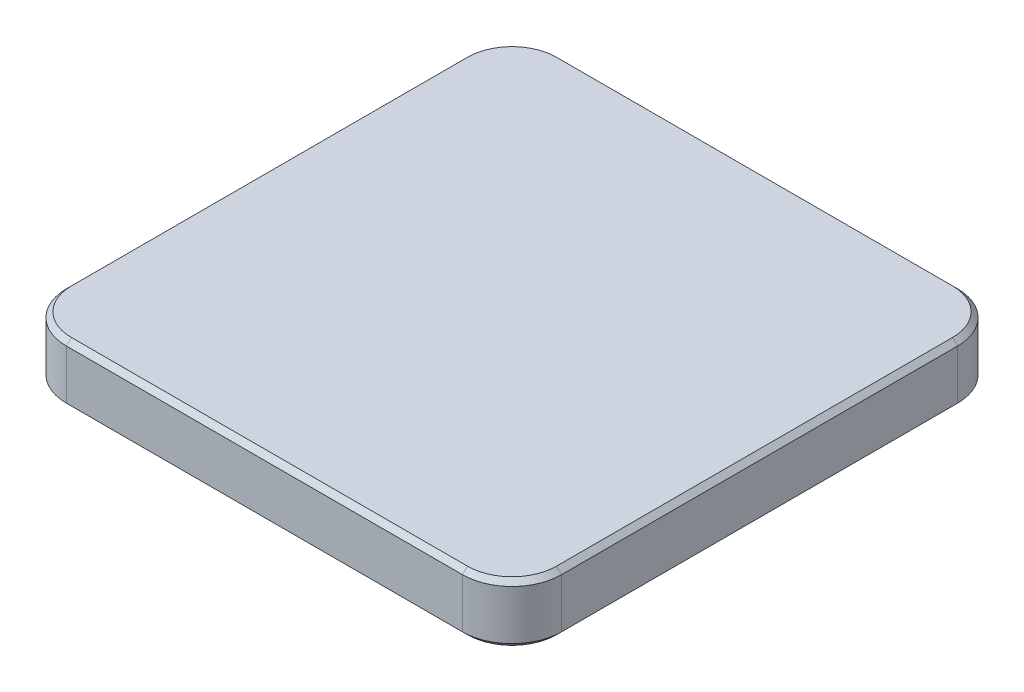
ISO-10303-21;
HEADER;
FILE_DESCRIPTION(('STEP AP214'),'2;1');
FILE_NAME('part.step','',(''),(''),'','','');
FILE_SCHEMA(('AUTOMOTIVE_DESIGN { 1 0 10303 214 1 1 1 1 }'));
ENDSEC;
DATA;
#1=APPLICATION_CONTEXT('core data for automotive mechanical design processes');
#2=APPLICATION_PROTOCOL_DEFINITION('international standard','automotive_design',2000,#1);
#3=PRODUCT_CONTEXT('',#1,'mechanical');
#4=PRODUCT('Part','Part','',(#3));
#5=PRODUCT_RELATED_PRODUCT_CATEGORY('part','',(#4));
#6=PRODUCT_DEFINITION_FORMATION('','',#4);
#7=PRODUCT_DEFINITION_CONTEXT('part definition',#1,'design');
#8=PRODUCT_DEFINITION('design','',#6,#7);
#9=PRODUCT_DEFINITION_SHAPE('','',#8);
#10=(LENGTH_UNIT() NAMED_UNIT(*) SI_UNIT(.MILLI.,.METRE.));
#11=(NAMED_UNIT(*) PLANE_ANGLE_UNIT() SI_UNIT($,.RADIAN.));
#12=(NAMED_UNIT(*) SI_UNIT($,.STERADIAN.) SOLID_ANGLE_UNIT());
#13=UNCERTAINTY_MEASURE_WITH_UNIT(LENGTH_MEASURE(1.E-05),#10,'distance_accuracy_value','');
#14=(GEOMETRIC_REPRESENTATION_CONTEXT(3) GLOBAL_UNCERTAINTY_ASSIGNED_CONTEXT((#13)) GLOBAL_UNIT_ASSIGNED_CONTEXT((#10,
#11,#12)) REPRESENTATION_CONTEXT('',''));
#15=CARTESIAN_POINT('',(0.,0.,0.));
#16=DIRECTION('',(0.,0.,1.));
#17=DIRECTION('',(1.,0.,0.));
#18=AXIS2_PLACEMENT_3D('',#15,#16,#17);
#19=CARTESIAN_POINT('',(0.,12.,0.));
#20=DIRECTION('',(1.,0.,0.));
#21=DIRECTION('',(0.,0.,-1.));
#22=AXIS2_PLACEMENT_3D('',#19,#20,#21);
#23=PLANE('',#22);
#24=DIRECTION('',(0.,-1.,0.));
#25=VECTOR('',#24,1.);
#26=CARTESIAN_POINT('',(0.,12.,-90.));
#27=LINE('',#26,#25);
#28=CARTESIAN_POINT('',(0.,11.,-90.));
#29=VERTEX_POINT('',#28);
#30=CARTESIAN_POINT('',(0.,1.,-90.));
#31=VERTEX_POINT('',#30);
#32=EDGE_CURVE('E280',#29,#31,#27,.T.);
#33=ORIENTED_EDGE('',*,*,#32,.T.);
#34=DIRECTION('',(0.,0.,1.));
#35=VECTOR('',#34,1.);
#36=CARTESIAN_POINT('',(0.,1.,-10.));
#37=LINE('',#36,#35);
#38=CARTESIAN_POINT('',(0.,1.,-10.));
#39=VERTEX_POINT('',#38);
#40=EDGE_CURVE('E207',#31,#39,#37,.T.);
#41=ORIENTED_EDGE('',*,*,#40,.T.);
#42=DIRECTION('',(0.,-1.,0.));
#43=VECTOR('',#42,1.);
#44=CARTESIAN_POINT('',(0.,12.,-10.));
#45=LINE('',#44,#43);
#46=CARTESIAN_POINT('',(0.,11.,-10.));
#47=VERTEX_POINT('',#46);
#48=EDGE_CURVE('E238',#39,#47,#45,.F.);
#49=ORIENTED_EDGE('',*,*,#48,.T.);
#50=DIRECTION('',(0.,0.,-1.));
#51=VECTOR('',#50,1.);
#52=CARTESIAN_POINT('',(0.,11.,0.));
#53=LINE('',#52,#51);
#54=EDGE_CURVE('E205',#47,#29,#53,.T.);
#55=ORIENTED_EDGE('',*,*,#54,.T.);
#56=EDGE_LOOP('',(#33,#41,#49,#55));
#57=FACE_BOUND('',#56,.T.);
#58=ADVANCED_FACE('F33',(#57),#23,.F.);
#59=CARTESIAN_POINT('',(0.,12.,0.));
#60=DIRECTION('',(0.,0.,-1.));
#61=DIRECTION('',(-1.,0.,0.));
#62=AXIS2_PLACEMENT_3D('',#59,#60,#61);
#63=PLANE('',#62);
#64=DIRECTION('',(0.,-1.,0.));
#65=VECTOR('',#64,1.);
#66=CARTESIAN_POINT('',(10.,12.,0.));
#67=LINE('',#66,#65);
#68=CARTESIAN_POINT('',(10.,11.,0.));
#69=VERTEX_POINT('',#68);
#70=CARTESIAN_POINT('',(10.,1.,0.));
#71=VERTEX_POINT('',#70);
#72=EDGE_CURVE('E276',#69,#71,#67,.T.);
#73=ORIENTED_EDGE('',*,*,#72,.T.);
#74=DIRECTION('',(1.,0.,0.));
#75=VECTOR('',#74,1.);
#76=CARTESIAN_POINT('',(90.,1.,0.));
#77=LINE('',#76,#75);
#78=CARTESIAN_POINT('',(90.,1.,0.));
#79=VERTEX_POINT('',#78);
#80=EDGE_CURVE('E182',#71,#79,#77,.T.);
#81=ORIENTED_EDGE('',*,*,#80,.T.);
#82=DIRECTION('',(0.,-1.,0.));
#83=VECTOR('',#82,1.);
#84=CARTESIAN_POINT('',(90.,12.,0.));
#85=LINE('',#84,#83);
#86=CARTESIAN_POINT('',(90.,11.,0.));
#87=VERTEX_POINT('',#86);
#88=EDGE_CURVE('E166',#79,#87,#85,.F.);
#89=ORIENTED_EDGE('',*,*,#88,.T.);
#90=DIRECTION('',(-1.,0.,0.));
#91=VECTOR('',#90,1.);
#92=CARTESIAN_POINT('',(0.,11.,0.));
#93=LINE('',#92,#91);
#94=EDGE_CURVE('E180',#87,#69,#93,.T.);
#95=ORIENTED_EDGE('',*,*,#94,.T.);
#96=EDGE_LOOP('',(#73,#81,#89,#95));
#97=FACE_BOUND('',#96,.T.);
#98=ADVANCED_FACE('F317',(#97),#63,.F.);
#99=CARTESIAN_POINT('',(100.,12.,0.));
#100=DIRECTION('',(-1.,0.,0.));
#101=DIRECTION('',(0.,0.,1.));
#102=AXIS2_PLACEMENT_3D('',#99,#100,#101);
#103=PLANE('',#102);
#104=DIRECTION('',(0.,-1.,0.));
#105=VECTOR('',#104,1.);
#106=CARTESIAN_POINT('',(100.,12.,-10.));
#107=LINE('',#106,#105);
#108=CARTESIAN_POINT('',(100.,11.,-10.));
#109=VERTEX_POINT('',#108);
#110=CARTESIAN_POINT('',(100.,1.,-10.));
#111=VERTEX_POINT('',#110);
#112=EDGE_CURVE('E290',#109,#111,#107,.T.);
#113=ORIENTED_EDGE('',*,*,#112,.T.);
#114=DIRECTION('',(0.,0.,-1.));
#115=VECTOR('',#114,1.);
#116=CARTESIAN_POINT('',(100.,1.,-90.));
#117=LINE('',#116,#115);
#118=CARTESIAN_POINT('',(100.,1.,-90.));
#119=VERTEX_POINT('',#118);
#120=EDGE_CURVE('E190',#111,#119,#117,.T.);
#121=ORIENTED_EDGE('',*,*,#120,.T.);
#122=DIRECTION('',(0.,-1.,0.));
#123=VECTOR('',#122,1.);
#124=CARTESIAN_POINT('',(100.,12.,-90.));
#125=LINE('',#124,#123);
#126=CARTESIAN_POINT('',(100.,11.,-90.));
#127=VERTEX_POINT('',#126);
#128=EDGE_CURVE('E293',#119,#127,#125,.F.);
#129=ORIENTED_EDGE('',*,*,#128,.T.);
#130=DIRECTION('',(0.,0.,1.));
#131=VECTOR('',#130,1.);
#132=CARTESIAN_POINT('',(100.,11.,0.));
#133=LINE('',#132,#131);
#134=EDGE_CURVE('E188',#127,#109,#133,.T.);
#135=ORIENTED_EDGE('',*,*,#134,.T.);
#136=EDGE_LOOP('',(#113,#121,#129,#135));
#137=FACE_BOUND('',#136,.T.);
#138=ADVANCED_FACE('F361',(#137),#103,.F.);
#139=CARTESIAN_POINT('',(0.,12.,-100.));
#140=DIRECTION('',(0.,0.,1.));
#141=DIRECTION('',(1.,0.,0.));
#142=AXIS2_PLACEMENT_3D('',#139,#140,#141);
#143=PLANE('',#142);
#144=DIRECTION('',(0.,-1.,0.));
#145=VECTOR('',#144,1.);
#146=CARTESIAN_POINT('',(90.,12.,-100.));
#147=LINE('',#146,#145);
#148=CARTESIAN_POINT('',(90.,11.,-100.));
#149=VERTEX_POINT('',#148);
#150=CARTESIAN_POINT('',(90.,1.,-100.));
#151=VERTEX_POINT('',#150);
#152=EDGE_CURVE('E282',#149,#151,#147,.T.);
#153=ORIENTED_EDGE('',*,*,#152,.T.);
#154=DIRECTION('',(-1.,0.,0.));
#155=VECTOR('',#154,1.);
#156=CARTESIAN_POINT('',(10.,1.,-100.));
#157=LINE('',#156,#155);
#158=CARTESIAN_POINT('',(10.,1.,-100.));
#159=VERTEX_POINT('',#158);
#160=EDGE_CURVE('E199',#151,#159,#157,.T.);
#161=ORIENTED_EDGE('',*,*,#160,.T.);
#162=DIRECTION('',(0.,-1.,0.));
#163=VECTOR('',#162,1.);
#164=CARTESIAN_POINT('',(10.,12.,-100.));
#165=LINE('',#164,#163);
#166=CARTESIAN_POINT('',(10.,11.,-100.));
#167=VERTEX_POINT('',#166);
#168=EDGE_CURVE('E287',#159,#167,#165,.F.);
#169=ORIENTED_EDGE('',*,*,#168,.T.);
#170=DIRECTION('',(1.,0.,0.));
#171=VECTOR('',#170,1.);
#172=CARTESIAN_POINT('',(0.,11.,-100.));
#173=LINE('',#172,#171);
#174=EDGE_CURVE('E197',#167,#149,#173,.T.);
#175=ORIENTED_EDGE('',*,*,#174,.T.);
#176=EDGE_LOOP('',(#153,#161,#169,#175));
#177=FACE_BOUND('',#176,.T.);
#178=ADVANCED_FACE('F345',(#177),#143,.F.);
#179=CARTESIAN_POINT('',(0.,12.,0.));
#180=DIRECTION('',(0.,-1.,0.));
#181=DIRECTION('',(0.,0.,-1.));
#182=AXIS2_PLACEMENT_3D('',#179,#180,#181);
#183=PLANE('',#182);
#184=DIRECTION('',(0.,0.,-1.));
#185=VECTOR('',#184,1.);
#186=CARTESIAN_POINT('',(99.,12.,0.));
#187=LINE('',#186,#185);
#188=CARTESIAN_POINT('',(99.,12.,-10.));
#189=VERTEX_POINT('',#188);
#190=CARTESIAN_POINT('',(99.,12.,-90.));
#191=VERTEX_POINT('',#190);
#192=EDGE_CURVE('E42',#189,#191,#187,.T.);
#193=ORIENTED_EDGE('',*,*,#192,.T.);
#194=CARTESIAN_POINT('',(90.,12.,-90.));
#195=DIRECTION('',(0.,-1.,0.));
#196=DIRECTION('',(0.,0.,-1.));
#197=AXIS2_PLACEMENT_3D('',#194,#195,#196);
#198=CIRCLE('',#197,8.99999999999998);
#199=CARTESIAN_POINT('',(90.,12.,-99.));
#200=VERTEX_POINT('',#199);
#201=EDGE_CURVE('E11',#191,#200,#198,.F.);
#202=ORIENTED_EDGE('',*,*,#201,.T.);
#203=DIRECTION('',(-1.,0.,0.));
#204=VECTOR('',#203,1.);
#205=CARTESIAN_POINT('',(0.,12.,-99.));
#206=LINE('',#205,#204);
#207=CARTESIAN_POINT('',(10.,12.,-99.));
#208=VERTEX_POINT('',#207);
#209=EDGE_CURVE('E209',#200,#208,#206,.T.);
#210=ORIENTED_EDGE('',*,*,#209,.T.);
#211=CARTESIAN_POINT('',(10.,12.,-90.));
#212=DIRECTION('',(0.,-1.,0.));
#213=DIRECTION('',(0.,0.,-1.));
#214=AXIS2_PLACEMENT_3D('',#211,#212,#213);
#215=CIRCLE('',#214,8.99999999999999);
#216=CARTESIAN_POINT('',(1.00000000000001,12.,-90.));
#217=VERTEX_POINT('',#216);
#218=EDGE_CURVE('E211',#208,#217,#215,.F.);
#219=ORIENTED_EDGE('',*,*,#218,.T.);
#220=DIRECTION('',(0.,0.,1.));
#221=VECTOR('',#220,1.);
#222=CARTESIAN_POINT('',(1.00000000000001,12.,0.));
#223=LINE('',#222,#221);
#224=CARTESIAN_POINT('',(1.00000000000001,12.,-10.));
#225=VERTEX_POINT('',#224);
#226=EDGE_CURVE('E213',#217,#225,#223,.T.);
#227=ORIENTED_EDGE('',*,*,#226,.T.);
#228=CARTESIAN_POINT('',(10.,12.,-10.));
#229=DIRECTION('',(0.,-1.,0.));
#230=DIRECTION('',(0.,0.,-1.));
#231=AXIS2_PLACEMENT_3D('',#228,#229,#230);
#232=CIRCLE('',#231,8.99999999999999);
#233=CARTESIAN_POINT('',(10.,12.,-1.00000000000001));
#234=VERTEX_POINT('',#233);
#235=EDGE_CURVE('E215',#225,#234,#232,.F.);
#236=ORIENTED_EDGE('',*,*,#235,.T.);
#237=DIRECTION('',(1.,0.,0.));
#238=VECTOR('',#237,1.);
#239=CARTESIAN_POINT('',(0.,12.,-1.00000000000001));
#240=LINE('',#239,#238);
#241=CARTESIAN_POINT('',(90.,12.,-1.00000000000001));
#242=VERTEX_POINT('',#241);
#243=EDGE_CURVE('E217',#234,#242,#240,.T.);
#244=ORIENTED_EDGE('',*,*,#243,.T.);
#245=CARTESIAN_POINT('',(90.,12.,-10.));
#246=DIRECTION('',(0.,-1.,0.));
#247=DIRECTION('',(0.,0.,-1.));
#248=AXIS2_PLACEMENT_3D('',#245,#246,#247);
#249=CIRCLE('',#248,8.99999999999998);
#250=EDGE_CURVE('E53',#242,#189,#249,.F.);
#251=ORIENTED_EDGE('',*,*,#250,.T.);
#252=EDGE_LOOP('',(#193,#202,#210,#219,#227,#236,#244,#251));
#253=FACE_BOUND('',#252,.T.);
#254=ADVANCED_FACE('F333',(#253),#183,.F.);
#255=CARTESIAN_POINT('',(0.,0.,0.));
#256=DIRECTION('',(0.,-1.,0.));
#257=DIRECTION('',(0.,0.,-1.));
#258=AXIS2_PLACEMENT_3D('',#255,#256,#257);
#259=PLANE('',#258);
#260=DIRECTION('',(-1.,0.,0.));
#261=VECTOR('',#260,1.);
#262=CARTESIAN_POINT('',(10.,0.,-1.));
#263=LINE('',#262,#261);
#264=CARTESIAN_POINT('',(90.,0.,-1.00000000000001));
#265=VERTEX_POINT('',#264);
#266=CARTESIAN_POINT('',(10.,0.,-1.));
#267=VERTEX_POINT('',#266);
#268=EDGE_CURVE('E170',#265,#267,#263,.T.);
#269=ORIENTED_EDGE('',*,*,#268,.T.);
#270=CARTESIAN_POINT('',(10.,0.,-10.));
#271=DIRECTION('',(0.,-1.,0.));
#272=DIRECTION('',(0.,0.,-1.));
#273=AXIS2_PLACEMENT_3D('',#270,#271,#272);
#274=CIRCLE('',#273,9.);
#275=CARTESIAN_POINT('',(1.,0.,-10.));
#276=VERTEX_POINT('',#275);
#277=EDGE_CURVE('E151',#267,#276,#274,.T.);
#278=ORIENTED_EDGE('',*,*,#277,.T.);
#279=DIRECTION('',(0.,0.,-1.));
#280=VECTOR('',#279,1.);
#281=CARTESIAN_POINT('',(1.,0.,-90.));
#282=LINE('',#281,#280);
#283=CARTESIAN_POINT('',(1.,0.,-90.));
#284=VERTEX_POINT('',#283);
#285=EDGE_CURVE('E159',#276,#284,#282,.T.);
#286=ORIENTED_EDGE('',*,*,#285,.T.);
#287=CARTESIAN_POINT('',(10.,0.,-90.));
#288=DIRECTION('',(0.,-1.,0.));
#289=DIRECTION('',(0.,0.,-1.));
#290=AXIS2_PLACEMENT_3D('',#287,#288,#289);
#291=CIRCLE('',#290,8.99999999999999);
#292=CARTESIAN_POINT('',(10.,0.,-99.));
#293=VERTEX_POINT('',#292);
#294=EDGE_CURVE('E165',#284,#293,#291,.T.);
#295=ORIENTED_EDGE('',*,*,#294,.T.);
#296=DIRECTION('',(1.,0.,0.));
#297=VECTOR('',#296,1.);
#298=CARTESIAN_POINT('',(90.,0.,-99.));
#299=LINE('',#298,#297);
#300=CARTESIAN_POINT('',(90.,0.,-99.));
#301=VERTEX_POINT('',#300);
#302=EDGE_CURVE('E300',#293,#301,#299,.T.);
#303=ORIENTED_EDGE('',*,*,#302,.T.);
#304=CARTESIAN_POINT('',(90.,0.,-90.));
#305=DIRECTION('',(0.,-1.,0.));
#306=DIRECTION('',(0.,0.,-1.));
#307=AXIS2_PLACEMENT_3D('',#304,#305,#306);
#308=CIRCLE('',#307,8.99999999999999);
#309=CARTESIAN_POINT('',(99.,0.,-90.));
#310=VERTEX_POINT('',#309);
#311=EDGE_CURVE('E302',#301,#310,#308,.T.);
#312=ORIENTED_EDGE('',*,*,#311,.T.);
#313=DIRECTION('',(0.,0.,1.));
#314=VECTOR('',#313,1.);
#315=CARTESIAN_POINT('',(99.,0.,-10.));
#316=LINE('',#315,#314);
#317=CARTESIAN_POINT('',(99.,0.,-10.));
#318=VERTEX_POINT('',#317);
#319=EDGE_CURVE('E304',#310,#318,#316,.T.);
#320=ORIENTED_EDGE('',*,*,#319,.T.);
#321=CARTESIAN_POINT('',(90.,0.,-10.));
#322=DIRECTION('',(0.,-1.,0.));
#323=DIRECTION('',(0.,0.,-1.));
#324=AXIS2_PLACEMENT_3D('',#321,#322,#323);
#325=CIRCLE('',#324,8.99999999999999);
#326=EDGE_CURVE('E175',#318,#265,#325,.T.);
#327=ORIENTED_EDGE('',*,*,#326,.T.);
#328=EDGE_LOOP('',(#269,#278,#286,#295,#303,#312,#320,#327));
#329=FACE_BOUND('',#328,.T.);
#330=ADVANCED_FACE('F168',(#329),#259,.T.);
#331=CARTESIAN_POINT('',(10.,12.,-90.));
#332=DIRECTION('',(0.,-1.,0.));
#333=DIRECTION('',(0.,0.,-1.));
#334=AXIS2_PLACEMENT_3D('',#331,#332,#333);
#335=CYLINDRICAL_SURFACE('',#334,10.);
#336=ORIENTED_EDGE('',*,*,#168,.F.);
#337=CARTESIAN_POINT('',(10.,1.,-90.));
#338=DIRECTION('',(0.,-1.,0.));
#339=DIRECTION('',(0.,0.,-1.));
#340=AXIS2_PLACEMENT_3D('',#337,#338,#339);
#341=CIRCLE('',#340,10.);
#342=EDGE_CURVE('E203',#159,#31,#341,.F.);
#343=ORIENTED_EDGE('',*,*,#342,.T.);
#344=ORIENTED_EDGE('',*,*,#32,.F.);
#345=CARTESIAN_POINT('',(10.,11.,-90.));
#346=DIRECTION('',(0.,-1.,0.));
#347=DIRECTION('',(0.,0.,-1.));
#348=AXIS2_PLACEMENT_3D('',#345,#346,#347);
#349=CIRCLE('',#348,10.);
#350=EDGE_CURVE('E201',#29,#167,#349,.T.);
#351=ORIENTED_EDGE('',*,*,#350,.T.);
#352=EDGE_LOOP('',(#336,#343,#344,#351));
#353=FACE_BOUND('',#352,.T.);
#354=ADVANCED_FACE('F375',(#353),#335,.T.);
#355=CARTESIAN_POINT('',(90.,12.,-90.));
#356=DIRECTION('',(0.,-1.,0.));
#357=DIRECTION('',(0.,0.,-1.));
#358=AXIS2_PLACEMENT_3D('',#355,#356,#357);
#359=CYLINDRICAL_SURFACE('',#358,10.);
#360=ORIENTED_EDGE('',*,*,#128,.F.);
#361=CARTESIAN_POINT('',(90.,1.,-90.));
#362=DIRECTION('',(0.,-1.,0.));
#363=DIRECTION('',(0.,0.,-1.));
#364=AXIS2_PLACEMENT_3D('',#361,#362,#363);
#365=CIRCLE('',#364,10.);
#366=EDGE_CURVE('E195',#119,#151,#365,.F.);
#367=ORIENTED_EDGE('',*,*,#366,.T.);
#368=ORIENTED_EDGE('',*,*,#152,.F.);
#369=CARTESIAN_POINT('',(90.,11.,-90.));
#370=DIRECTION('',(0.,-1.,0.));
#371=DIRECTION('',(0.,0.,-1.));
#372=AXIS2_PLACEMENT_3D('',#369,#370,#371);
#373=CIRCLE('',#372,10.);
#374=EDGE_CURVE('E192',#149,#127,#373,.T.);
#375=ORIENTED_EDGE('',*,*,#374,.T.);
#376=EDGE_LOOP('',(#360,#367,#368,#375));
#377=FACE_BOUND('',#376,.T.);
#378=ADVANCED_FACE('F350',(#377),#359,.T.);
#379=CARTESIAN_POINT('',(90.,12.,-10.));
#380=DIRECTION('',(0.,-1.,0.));
#381=DIRECTION('',(0.,0.,-1.));
#382=AXIS2_PLACEMENT_3D('',#379,#380,#381);
#383=CYLINDRICAL_SURFACE('',#382,10.);
#384=ORIENTED_EDGE('',*,*,#88,.F.);
#385=CARTESIAN_POINT('',(90.,1.,-10.));
#386=DIRECTION('',(0.,-1.,0.));
#387=DIRECTION('',(0.,0.,-1.));
#388=AXIS2_PLACEMENT_3D('',#385,#386,#387);
#389=CIRCLE('',#388,10.);
#390=EDGE_CURVE('E186',#79,#111,#389,.F.);
#391=ORIENTED_EDGE('',*,*,#390,.T.);
#392=ORIENTED_EDGE('',*,*,#112,.F.);
#393=CARTESIAN_POINT('',(90.,11.,-10.));
#394=DIRECTION('',(0.,-1.,0.));
#395=DIRECTION('',(0.,0.,-1.));
#396=AXIS2_PLACEMENT_3D('',#393,#394,#395);
#397=CIRCLE('',#396,10.);
#398=EDGE_CURVE('E184',#109,#87,#397,.T.);
#399=ORIENTED_EDGE('',*,*,#398,.T.);
#400=EDGE_LOOP('',(#384,#391,#392,#399));
#401=FACE_BOUND('',#400,.T.);
#402=ADVANCED_FACE('F319',(#401),#383,.T.);
#403=CARTESIAN_POINT('',(10.,12.,-10.));
#404=DIRECTION('',(0.,-1.,0.));
#405=DIRECTION('',(0.,0.,-1.));
#406=AXIS2_PLACEMENT_3D('',#403,#404,#405);
#407=CYLINDRICAL_SURFACE('',#406,10.);
#408=ORIENTED_EDGE('',*,*,#48,.F.);
#409=CARTESIAN_POINT('',(10.,1.,-10.));
#410=DIRECTION('',(0.,-1.,0.));
#411=DIRECTION('',(0.,0.,-1.));
#412=AXIS2_PLACEMENT_3D('',#409,#410,#411);
#413=CIRCLE('',#412,10.);
#414=EDGE_CURVE('E153',#39,#71,#413,.F.);
#415=ORIENTED_EDGE('',*,*,#414,.T.);
#416=ORIENTED_EDGE('',*,*,#72,.F.);
#417=CARTESIAN_POINT('',(10.,11.,-10.));
#418=DIRECTION('',(0.,-1.,0.));
#419=DIRECTION('',(0.,0.,-1.));
#420=AXIS2_PLACEMENT_3D('',#417,#418,#419);
#421=CIRCLE('',#420,10.);
#422=EDGE_CURVE('E172',#69,#47,#421,.T.);
#423=ORIENTED_EDGE('',*,*,#422,.T.);
#424=EDGE_LOOP('',(#408,#415,#416,#423));
#425=FACE_BOUND('',#424,.T.);
#426=ADVANCED_FACE('F274',(#425),#407,.T.);
#427=CARTESIAN_POINT('',(90.,0.,-90.));
#428=DIRECTION('',(0.,1.,0.));
#429=DIRECTION('',(0.,0.,1.));
#430=AXIS2_PLACEMENT_3D('',#427,#428,#429);
#431=CONICAL_SURFACE('',#430,8.99999999999999,0.785398163397451);
#432=DIRECTION('',(0.,-0.707106781186547,0.707106781186547));
#433=VECTOR('',#432,1.);
#434=CARTESIAN_POINT('',(90.,1.,-100.));
#435=LINE('',#434,#433);
#436=EDGE_CURVE('E232',#151,#301,#435,.T.);
#437=ORIENTED_EDGE('',*,*,#436,.F.);
#438=ORIENTED_EDGE('',*,*,#366,.F.);
#439=DIRECTION('',(0.707106781186547,0.707106781186547,0.));
#440=VECTOR('',#439,1.);
#441=CARTESIAN_POINT('',(99.,0.,-90.));
#442=LINE('',#441,#440);
#443=EDGE_CURVE('E235',#310,#119,#442,.T.);
#444=ORIENTED_EDGE('',*,*,#443,.F.);
#445=ORIENTED_EDGE('',*,*,#311,.F.);
#446=EDGE_LOOP('',(#437,#438,#444,#445));
#447=FACE_BOUND('',#446,.T.);
#448=ADVANCED_FACE('F354',(#447),#431,.T.);
#449=CARTESIAN_POINT('',(100.,1.,0.));
#450=DIRECTION('',(0.707106781186547,-0.707106781186547,0.));
#451=DIRECTION('',(0.,0.,1.));
#452=AXIS2_PLACEMENT_3D('',#449,#450,#451);
#453=PLANE('',#452);
#454=ORIENTED_EDGE('',*,*,#443,.T.);
#455=ORIENTED_EDGE('',*,*,#120,.F.);
#456=DIRECTION('',(0.707106781186547,0.707106781186547,0.));
#457=VECTOR('',#456,1.);
#458=CARTESIAN_POINT('',(99.,0.,-10.));
#459=LINE('',#458,#457);
#460=EDGE_CURVE('E229',#318,#111,#459,.T.);
#461=ORIENTED_EDGE('',*,*,#460,.F.);
#462=ORIENTED_EDGE('',*,*,#319,.F.);
#463=EDGE_LOOP('',(#454,#455,#461,#462));
#464=FACE_BOUND('',#463,.T.);
#465=ADVANCED_FACE('F359',(#464),#453,.T.);
#466=CARTESIAN_POINT('',(0.,1.,-100.));
#467=DIRECTION('',(0.,-0.707106781186547,-0.707106781186547));
#468=DIRECTION('',(1.,0.,0.));
#469=AXIS2_PLACEMENT_3D('',#466,#467,#468);
#470=PLANE('',#469);
#471=ORIENTED_EDGE('',*,*,#436,.T.);
#472=ORIENTED_EDGE('',*,*,#302,.F.);
#473=DIRECTION('',(0.,-0.707106781186547,0.707106781186547));
#474=VECTOR('',#473,1.);
#475=CARTESIAN_POINT('',(10.,1.,-100.));
#476=LINE('',#475,#474);
#477=EDGE_CURVE('E226',#159,#293,#476,.T.);
#478=ORIENTED_EDGE('',*,*,#477,.F.);
#479=ORIENTED_EDGE('',*,*,#160,.F.);
#480=EDGE_LOOP('',(#471,#472,#478,#479));
#481=FACE_BOUND('',#480,.T.);
#482=ADVANCED_FACE('F397',(#481),#470,.T.);
#483=CARTESIAN_POINT('',(90.,0.,-10.));
#484=DIRECTION('',(0.,1.,0.));
#485=DIRECTION('',(0.,0.,1.));
#486=AXIS2_PLACEMENT_3D('',#483,#484,#485);
#487=CONICAL_SURFACE('',#486,8.99999999999999,0.785398163397451);
#488=ORIENTED_EDGE('',*,*,#460,.T.);
#489=ORIENTED_EDGE('',*,*,#390,.F.);
#490=DIRECTION('',(0.,0.707106781186546,0.707106781186549));
#491=VECTOR('',#490,1.);
#492=CARTESIAN_POINT('',(90.,0.,-1.00000000000001));
#493=LINE('',#492,#491);
#494=EDGE_CURVE('E223',#265,#79,#493,.T.);
#495=ORIENTED_EDGE('',*,*,#494,.F.);
#496=ORIENTED_EDGE('',*,*,#326,.F.);
#497=EDGE_LOOP('',(#488,#489,#495,#496));
#498=FACE_BOUND('',#497,.T.);
#499=ADVANCED_FACE('F311',(#498),#487,.T.);
#500=CARTESIAN_POINT('',(10.,0.,-90.));
#501=DIRECTION('',(0.,1.,0.));
#502=DIRECTION('',(0.,0.,1.));
#503=AXIS2_PLACEMENT_3D('',#500,#501,#502);
#504=CONICAL_SURFACE('',#503,9.,0.785398163397448);
#505=ORIENTED_EDGE('',*,*,#477,.T.);
#506=ORIENTED_EDGE('',*,*,#294,.F.);
#507=DIRECTION('',(0.707106781186549,-0.707106781186546,0.));
#508=VECTOR('',#507,1.);
#509=CARTESIAN_POINT('',(0.,1.,-90.));
#510=LINE('',#509,#508);
#511=EDGE_CURVE('E162',#31,#284,#510,.T.);
#512=ORIENTED_EDGE('',*,*,#511,.F.);
#513=ORIENTED_EDGE('',*,*,#342,.F.);
#514=EDGE_LOOP('',(#505,#506,#512,#513));
#515=FACE_BOUND('',#514,.T.);
#516=ADVANCED_FACE('F391',(#515),#504,.T.);
#517=CARTESIAN_POINT('',(0.,1.,0.));
#518=DIRECTION('',(0.,-0.707106781186547,0.707106781186547));
#519=DIRECTION('',(-1.,0.,0.));
#520=AXIS2_PLACEMENT_3D('',#517,#518,#519);
#521=PLANE('',#520);
#522=ORIENTED_EDGE('',*,*,#494,.T.);
#523=ORIENTED_EDGE('',*,*,#80,.F.);
#524=DIRECTION('',(0.,0.707106781186547,0.707106781186547));
#525=VECTOR('',#524,1.);
#526=CARTESIAN_POINT('',(10.,0.,-1.));
#527=LINE('',#526,#525);
#528=EDGE_CURVE('E156',#267,#71,#527,.T.);
#529=ORIENTED_EDGE('',*,*,#528,.F.);
#530=ORIENTED_EDGE('',*,*,#268,.F.);
#531=EDGE_LOOP('',(#522,#523,#529,#530));
#532=FACE_BOUND('',#531,.T.);
#533=ADVANCED_FACE('F314',(#532),#521,.T.);
#534=CARTESIAN_POINT('',(0.,1.,0.));
#535=DIRECTION('',(-0.707106781186547,-0.707106781186547,0.));
#536=DIRECTION('',(0.,0.,-1.));
#537=AXIS2_PLACEMENT_3D('',#534,#535,#536);
#538=PLANE('',#537);
#539=ORIENTED_EDGE('',*,*,#511,.T.);
#540=ORIENTED_EDGE('',*,*,#285,.F.);
#541=DIRECTION('',(0.707106781186547,-0.707106781186547,0.));
#542=VECTOR('',#541,1.);
#543=CARTESIAN_POINT('',(0.,1.,-10.));
#544=LINE('',#543,#542);
#545=EDGE_CURVE('E147',#39,#276,#544,.T.);
#546=ORIENTED_EDGE('',*,*,#545,.F.);
#547=ORIENTED_EDGE('',*,*,#40,.F.);
#548=EDGE_LOOP('',(#539,#540,#546,#547));
#549=FACE_BOUND('',#548,.T.);
#550=ADVANCED_FACE('F160',(#549),#538,.T.);
#551=CARTESIAN_POINT('',(10.,0.,-10.));
#552=DIRECTION('',(0.,1.,0.));
#553=DIRECTION('',(0.,0.,1.));
#554=AXIS2_PLACEMENT_3D('',#551,#552,#553);
#555=CONICAL_SURFACE('',#554,9.,0.785398163397448);
#556=ORIENTED_EDGE('',*,*,#528,.T.);
#557=ORIENTED_EDGE('',*,*,#414,.F.);
#558=ORIENTED_EDGE('',*,*,#545,.T.);
#559=ORIENTED_EDGE('',*,*,#277,.F.);
#560=EDGE_LOOP('',(#556,#557,#558,#559));
#561=FACE_BOUND('',#560,.T.);
#562=ADVANCED_FACE('F149',(#561),#555,.T.);
#563=CARTESIAN_POINT('',(10.,12.,-10.));
#564=DIRECTION('',(0.,-1.,0.));
#565=DIRECTION('',(0.,0.,-1.));
#566=AXIS2_PLACEMENT_3D('',#563,#564,#565);
#567=CONICAL_SURFACE('',#566,8.99999999999999,0.785398163397448);
#568=DIRECTION('',(0.707106781186547,0.707106781186547,0.));
#569=VECTOR('',#568,1.);
#570=CARTESIAN_POINT('',(0.,11.,-10.));
#571=LINE('',#570,#569);
#572=EDGE_CURVE('E254',#47,#225,#571,.T.);
#573=ORIENTED_EDGE('',*,*,#572,.F.);
#574=ORIENTED_EDGE('',*,*,#422,.F.);
#575=DIRECTION('',(0.,-0.707106781186547,0.707106781186547));
#576=VECTOR('',#575,1.);
#577=CARTESIAN_POINT('',(10.,12.,-1.00000000000001));
#578=LINE('',#577,#576);
#579=EDGE_CURVE('E37',#234,#69,#578,.T.);
#580=ORIENTED_EDGE('',*,*,#579,.F.);
#581=ORIENTED_EDGE('',*,*,#235,.F.);
#582=EDGE_LOOP('',(#573,#574,#580,#581));
#583=FACE_BOUND('',#582,.T.);
#584=ADVANCED_FACE('F35',(#583),#567,.T.);
#585=CARTESIAN_POINT('',(0.,12.,-1.00000000000001));
#586=DIRECTION('',(0.,-0.707106781186547,-0.707106781186547));
#587=DIRECTION('',(1.,0.,0.));
#588=AXIS2_PLACEMENT_3D('',#585,#586,#587);
#589=PLANE('',#588);
#590=ORIENTED_EDGE('',*,*,#579,.T.);
#591=ORIENTED_EDGE('',*,*,#94,.F.);
#592=DIRECTION('',(0.,-0.707106781186547,0.707106781186547));
#593=VECTOR('',#592,1.);
#594=CARTESIAN_POINT('',(90.,12.,-1.00000000000001));
#595=LINE('',#594,#593);
#596=EDGE_CURVE('E252',#242,#87,#595,.T.);
#597=ORIENTED_EDGE('',*,*,#596,.F.);
#598=ORIENTED_EDGE('',*,*,#243,.F.);
#599=EDGE_LOOP('',(#590,#591,#597,#598));
#600=FACE_BOUND('',#599,.T.);
#601=ADVANCED_FACE('F265',(#600),#589,.F.);
#602=CARTESIAN_POINT('',(1.00000000000001,12.,0.));
#603=DIRECTION('',(0.707106781186547,-0.707106781186547,0.));
#604=DIRECTION('',(0.,0.,1.));
#605=AXIS2_PLACEMENT_3D('',#602,#603,#604);
#606=PLANE('',#605);
#607=ORIENTED_EDGE('',*,*,#572,.T.);
#608=ORIENTED_EDGE('',*,*,#226,.F.);
#609=DIRECTION('',(0.707106781186547,0.707106781186547,0.));
#610=VECTOR('',#609,1.);
#611=CARTESIAN_POINT('',(0.,11.,-90.));
#612=LINE('',#611,#610);
#613=EDGE_CURVE('E249',#29,#217,#612,.T.);
#614=ORIENTED_EDGE('',*,*,#613,.F.);
#615=ORIENTED_EDGE('',*,*,#54,.F.);
#616=EDGE_LOOP('',(#607,#608,#614,#615));
#617=FACE_BOUND('',#616,.T.);
#618=ADVANCED_FACE('F415',(#617),#606,.F.);
#619=CARTESIAN_POINT('',(90.,12.,-10.));
#620=DIRECTION('',(0.,-1.,0.));
#621=DIRECTION('',(0.,0.,-1.));
#622=AXIS2_PLACEMENT_3D('',#619,#620,#621);
#623=CONICAL_SURFACE('',#622,8.99999999999998,0.785398163397451);
#624=ORIENTED_EDGE('',*,*,#596,.T.);
#625=ORIENTED_EDGE('',*,*,#398,.F.);
#626=DIRECTION('',(0.707106781186547,-0.707106781186547,0.));
#627=VECTOR('',#626,1.);
#628=CARTESIAN_POINT('',(99.,12.,-10.));
#629=LINE('',#628,#627);
#630=EDGE_CURVE('E246',#189,#109,#629,.T.);
#631=ORIENTED_EDGE('',*,*,#630,.F.);
#632=ORIENTED_EDGE('',*,*,#250,.F.);
#633=EDGE_LOOP('',(#624,#625,#631,#632));
#634=FACE_BOUND('',#633,.T.);
#635=ADVANCED_FACE('F323',(#634),#623,.T.);
#636=CARTESIAN_POINT('',(10.,12.,-90.));
#637=DIRECTION('',(0.,-1.,0.));
#638=DIRECTION('',(0.,0.,-1.));
#639=AXIS2_PLACEMENT_3D('',#636,#637,#638);
#640=CONICAL_SURFACE('',#639,8.99999999999999,0.785398163397448);
#641=ORIENTED_EDGE('',*,*,#613,.T.);
#642=ORIENTED_EDGE('',*,*,#218,.F.);
#643=DIRECTION('',(0.,0.707106781186547,0.707106781186547));
#644=VECTOR('',#643,1.);
#645=CARTESIAN_POINT('',(10.,11.,-100.));
#646=LINE('',#645,#644);
#647=EDGE_CURVE('E243',#167,#208,#646,.T.);
#648=ORIENTED_EDGE('',*,*,#647,.F.);
#649=ORIENTED_EDGE('',*,*,#350,.F.);
#650=EDGE_LOOP('',(#641,#642,#648,#649));
#651=FACE_BOUND('',#650,.T.);
#652=ADVANCED_FACE('F338',(#651),#640,.T.);
#653=CARTESIAN_POINT('',(99.,12.,0.));
#654=DIRECTION('',(-0.707106781186547,-0.707106781186547,0.));
#655=DIRECTION('',(0.,0.,-1.));
#656=AXIS2_PLACEMENT_3D('',#653,#654,#655);
#657=PLANE('',#656);
#658=ORIENTED_EDGE('',*,*,#630,.T.);
#659=ORIENTED_EDGE('',*,*,#134,.F.);
#660=DIRECTION('',(0.707106781186547,-0.707106781186547,0.));
#661=VECTOR('',#660,1.);
#662=CARTESIAN_POINT('',(99.,12.,-90.));
#663=LINE('',#662,#661);
#664=EDGE_CURVE('E241',#191,#127,#663,.T.);
#665=ORIENTED_EDGE('',*,*,#664,.F.);
#666=ORIENTED_EDGE('',*,*,#192,.F.);
#667=EDGE_LOOP('',(#658,#659,#665,#666));
#668=FACE_BOUND('',#667,.T.);
#669=ADVANCED_FACE('F326',(#668),#657,.F.);
#670=CARTESIAN_POINT('',(0.,12.,-99.));
#671=DIRECTION('',(0.,-0.707106781186547,0.707106781186547));
#672=DIRECTION('',(-1.,0.,0.));
#673=AXIS2_PLACEMENT_3D('',#670,#671,#672);
#674=PLANE('',#673);
#675=ORIENTED_EDGE('',*,*,#647,.T.);
#676=ORIENTED_EDGE('',*,*,#209,.F.);
#677=DIRECTION('',(0.,0.707106781186547,0.707106781186547));
#678=VECTOR('',#677,1.);
#679=CARTESIAN_POINT('',(90.,11.,-100.));
#680=LINE('',#679,#678);
#681=EDGE_CURVE('E239',#149,#200,#680,.T.);
#682=ORIENTED_EDGE('',*,*,#681,.F.);
#683=ORIENTED_EDGE('',*,*,#174,.F.);
#684=EDGE_LOOP('',(#675,#676,#682,#683));
#685=FACE_BOUND('',#684,.T.);
#686=ADVANCED_FACE('F342',(#685),#674,.F.);
#687=CARTESIAN_POINT('',(90.,12.,-90.));
#688=DIRECTION('',(0.,-1.,0.));
#689=DIRECTION('',(0.,0.,-1.));
#690=AXIS2_PLACEMENT_3D('',#687,#688,#689);
#691=CONICAL_SURFACE('',#690,8.99999999999998,0.785398163397451);
#692=ORIENTED_EDGE('',*,*,#664,.T.);
#693=ORIENTED_EDGE('',*,*,#374,.F.);
#694=ORIENTED_EDGE('',*,*,#681,.T.);
#695=ORIENTED_EDGE('',*,*,#201,.F.);
#696=EDGE_LOOP('',(#692,#693,#694,#695));
#697=FACE_BOUND('',#696,.T.);
#698=ADVANCED_FACE('F330',(#697),#691,.T.);
#699=CLOSED_SHELL('',(#58,#98,#138,#178,#254,#330,#354,#378,#402,#426,#448,#465,#482,#499,#516,
#533,#550,#562,#584,#601,#618,#635,#652,#669,#686,#698));
#700=MANIFOLD_SOLID_BREP('B2',#699);
#701=ADVANCED_BREP_SHAPE_REPRESENTATION('',(#18,#700),#14);
#702=SHAPE_DEFINITION_REPRESENTATION(#9,#701);
ENDSEC;
END-ISO-10303-21;
